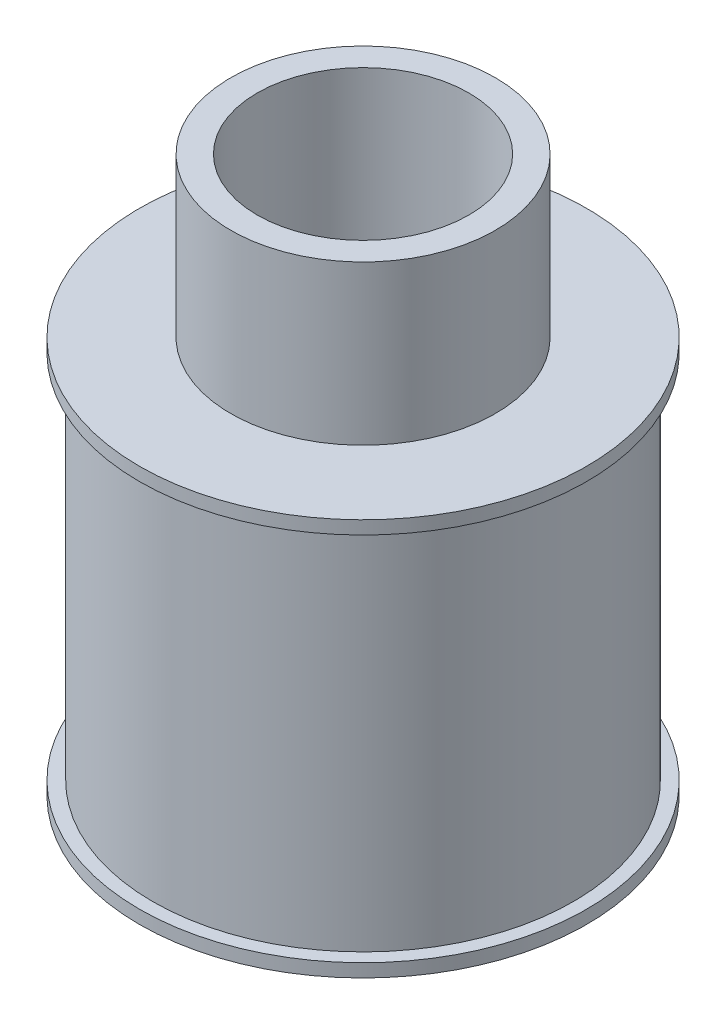
ISO-10303-21;
HEADER;
FILE_DESCRIPTION(('STEP AP214'),'2;1');
FILE_NAME('part.step','',(''),(''),'','','');
FILE_SCHEMA(('AUTOMOTIVE_DESIGN { 1 0 10303 214 1 1 1 1 }'));
ENDSEC;
DATA;
#1=APPLICATION_CONTEXT('core data for automotive mechanical design processes');
#2=APPLICATION_PROTOCOL_DEFINITION('international standard','automotive_design',2000,#1);
#3=PRODUCT_CONTEXT('',#1,'mechanical');
#4=PRODUCT('Part','Part','',(#3));
#5=PRODUCT_RELATED_PRODUCT_CATEGORY('part','',(#4));
#6=PRODUCT_DEFINITION_FORMATION('','',#4);
#7=PRODUCT_DEFINITION_CONTEXT('part definition',#1,'design');
#8=PRODUCT_DEFINITION('design','',#6,#7);
#9=PRODUCT_DEFINITION_SHAPE('','',#8);
#10=(LENGTH_UNIT() NAMED_UNIT(*) SI_UNIT(.MILLI.,.METRE.));
#11=(NAMED_UNIT(*) PLANE_ANGLE_UNIT() SI_UNIT($,.RADIAN.));
#12=(NAMED_UNIT(*) SI_UNIT($,.STERADIAN.) SOLID_ANGLE_UNIT());
#13=UNCERTAINTY_MEASURE_WITH_UNIT(LENGTH_MEASURE(1.E-05),#10,'distance_accuracy_value','');
#14=(GEOMETRIC_REPRESENTATION_CONTEXT(3) GLOBAL_UNCERTAINTY_ASSIGNED_CONTEXT((#13)) GLOBAL_UNIT_ASSIGNED_CONTEXT((#10,
#11,#12)) REPRESENTATION_CONTEXT('',''));
#15=CARTESIAN_POINT('',(0.,0.,0.));
#16=DIRECTION('',(0.,0.,1.));
#17=DIRECTION('',(1.,0.,0.));
#18=AXIS2_PLACEMENT_3D('',#15,#16,#17);
#19=CARTESIAN_POINT('',(0.,7.5,0.));
#20=DIRECTION('',(0.,-1.,0.));
#21=DIRECTION('',(0.,0.,-1.));
#22=AXIS2_PLACEMENT_3D('',#19,#20,#21);
#23=CYLINDRICAL_SURFACE('',#22,7.95);
#24=CARTESIAN_POINT('',(0.,-7.,0.));
#25=DIRECTION('',(0.,1.,0.));
#26=DIRECTION('',(0.,0.,1.));
#27=AXIS2_PLACEMENT_3D('',#24,#25,#26);
#28=CIRCLE('',#27,7.95);
#29=CARTESIAN_POINT('',(0.,-7.,7.95));
#30=VERTEX_POINT('',#29);
#31=EDGE_CURVE('E44',#30,#30,#28,.T.);
#32=ORIENTED_EDGE('',*,*,#31,.T.);
#33=EDGE_LOOP('',(#32));
#34=FACE_BOUND('',#33,.T.);
#35=CARTESIAN_POINT('',(0.,7.,0.));
#36=DIRECTION('',(0.,1.,0.));
#37=DIRECTION('',(0.,0.,1.));
#38=AXIS2_PLACEMENT_3D('',#35,#36,#37);
#39=CIRCLE('',#38,7.95);
#40=CARTESIAN_POINT('',(0.,7.,7.95));
#41=VERTEX_POINT('',#40);
#42=EDGE_CURVE('E10',#41,#41,#39,.T.);
#43=ORIENTED_EDGE('',*,*,#42,.F.);
#44=EDGE_LOOP('',(#43));
#45=FACE_BOUND('',#44,.T.);
#46=ADVANCED_FACE('F41',(#34,#45),#23,.T.);
#47=CARTESIAN_POINT('',(0.,7.,0.));
#48=DIRECTION('',(0.,1.,0.));
#49=DIRECTION('',(0.,0.,1.));
#50=AXIS2_PLACEMENT_3D('',#47,#48,#49);
#51=CYLINDRICAL_SURFACE('',#50,8.45);
#52=CARTESIAN_POINT('',(0.,7.,0.));
#53=DIRECTION('',(0.,1.,0.));
#54=DIRECTION('',(0.,0.,1.));
#55=AXIS2_PLACEMENT_3D('',#52,#53,#54);
#56=CIRCLE('',#55,8.45);
#57=CARTESIAN_POINT('',(0.,7.,8.45));
#58=VERTEX_POINT('',#57);
#59=EDGE_CURVE('E49',#58,#58,#56,.T.);
#60=ORIENTED_EDGE('',*,*,#59,.T.);
#61=EDGE_LOOP('',(#60));
#62=FACE_BOUND('',#61,.T.);
#63=CARTESIAN_POINT('',(0.,7.5,0.));
#64=DIRECTION('',(0.,1.,0.));
#65=DIRECTION('',(0.,0.,1.));
#66=AXIS2_PLACEMENT_3D('',#63,#64,#65);
#67=CIRCLE('',#66,8.45);
#68=CARTESIAN_POINT('',(0.,7.5,8.45));
#69=VERTEX_POINT('',#68);
#70=EDGE_CURVE('E55',#69,#69,#67,.T.);
#71=ORIENTED_EDGE('',*,*,#70,.F.);
#72=EDGE_LOOP('',(#71));
#73=FACE_BOUND('',#72,.T.);
#74=ADVANCED_FACE('F120',(#62,#73),#51,.T.);
#75=CARTESIAN_POINT('',(0.,7.,0.));
#76=DIRECTION('',(0.,1.,0.));
#77=DIRECTION('',(0.,0.,1.));
#78=AXIS2_PLACEMENT_3D('',#75,#76,#77);
#79=PLANE('',#78);
#80=ORIENTED_EDGE('',*,*,#42,.T.);
#81=EDGE_LOOP('',(#80));
#82=FACE_BOUND('',#81,.T.);
#83=ORIENTED_EDGE('',*,*,#59,.F.);
#84=EDGE_LOOP('',(#83));
#85=FACE_BOUND('',#84,.T.);
#86=ADVANCED_FACE('F115',(#82,#85),#79,.F.);
#87=CARTESIAN_POINT('',(0.,7.5,0.));
#88=DIRECTION('',(0.,1.,0.));
#89=DIRECTION('',(0.,0.,1.));
#90=AXIS2_PLACEMENT_3D('',#87,#88,#89);
#91=PLANE('',#90);
#92=CARTESIAN_POINT('',(0.,7.5,0.));
#93=DIRECTION('',(0.,1.,0.));
#94=DIRECTION('',(0.,0.,1.));
#95=AXIS2_PLACEMENT_3D('',#92,#93,#94);
#96=CIRCLE('',#95,5.);
#97=CARTESIAN_POINT('',(0.,7.5,-5.));
#98=VERTEX_POINT('',#97);
#99=EDGE_CURVE('E66',#98,#98,#96,.F.);
#100=ORIENTED_EDGE('',*,*,#99,.T.);
#101=EDGE_LOOP('',(#100));
#102=FACE_BOUND('',#101,.T.);
#103=ORIENTED_EDGE('',*,*,#70,.T.);
#104=EDGE_LOOP('',(#103));
#105=FACE_BOUND('',#104,.T.);
#106=ADVANCED_FACE('F105',(#102,#105),#91,.T.);
#107=CARTESIAN_POINT('',(0.,-7.,0.));
#108=DIRECTION('',(0.,-1.,0.));
#109=DIRECTION('',(0.,0.,-1.));
#110=AXIS2_PLACEMENT_3D('',#107,#108,#109);
#111=CYLINDRICAL_SURFACE('',#110,8.45);
#112=CARTESIAN_POINT('',(0.,-7.,0.));
#113=DIRECTION('',(0.,1.,0.));
#114=DIRECTION('',(0.,0.,1.));
#115=AXIS2_PLACEMENT_3D('',#112,#113,#114);
#116=CIRCLE('',#115,8.45);
#117=CARTESIAN_POINT('',(0.,-7.,8.45));
#118=VERTEX_POINT('',#117);
#119=EDGE_CURVE('E65',#118,#118,#116,.T.);
#120=ORIENTED_EDGE('',*,*,#119,.F.);
#121=EDGE_LOOP('',(#120));
#122=FACE_BOUND('',#121,.T.);
#123=CARTESIAN_POINT('',(0.,-7.5,0.));
#124=DIRECTION('',(0.,1.,0.));
#125=DIRECTION('',(0.,0.,1.));
#126=AXIS2_PLACEMENT_3D('',#123,#124,#125);
#127=CIRCLE('',#126,8.45);
#128=CARTESIAN_POINT('',(0.,-7.5,8.45));
#129=VERTEX_POINT('',#128);
#130=EDGE_CURVE('E61',#129,#129,#127,.T.);
#131=ORIENTED_EDGE('',*,*,#130,.T.);
#132=EDGE_LOOP('',(#131));
#133=FACE_BOUND('',#132,.T.);
#134=ADVANCED_FACE('F103',(#122,#133),#111,.T.);
#135=CARTESIAN_POINT('',(0.,-7.,0.));
#136=DIRECTION('',(0.,1.,0.));
#137=DIRECTION('',(0.,0.,1.));
#138=AXIS2_PLACEMENT_3D('',#135,#136,#137);
#139=PLANE('',#138);
#140=ORIENTED_EDGE('',*,*,#31,.F.);
#141=EDGE_LOOP('',(#140));
#142=FACE_BOUND('',#141,.T.);
#143=ORIENTED_EDGE('',*,*,#119,.T.);
#144=EDGE_LOOP('',(#143));
#145=FACE_BOUND('',#144,.T.);
#146=ADVANCED_FACE('F100',(#142,#145),#139,.T.);
#147=CARTESIAN_POINT('',(0.,-7.5,0.));
#148=DIRECTION('',(0.,1.,0.));
#149=DIRECTION('',(0.,0.,1.));
#150=AXIS2_PLACEMENT_3D('',#147,#148,#149);
#151=PLANE('',#150);
#152=CARTESIAN_POINT('',(0.,-7.5,0.));
#153=DIRECTION('',(0.,-1.,0.));
#154=DIRECTION('',(0.,0.,-1.));
#155=AXIS2_PLACEMENT_3D('',#152,#153,#154);
#156=CIRCLE('',#155,4.);
#157=CARTESIAN_POINT('',(0.,-7.5,-4.));
#158=VERTEX_POINT('',#157);
#159=EDGE_CURVE('E78',#158,#158,#156,.T.);
#160=ORIENTED_EDGE('',*,*,#159,.F.);
#161=EDGE_LOOP('',(#160));
#162=FACE_BOUND('',#161,.T.);
#163=ORIENTED_EDGE('',*,*,#130,.F.);
#164=EDGE_LOOP('',(#163));
#165=FACE_BOUND('',#164,.T.);
#166=ADVANCED_FACE('F96',(#162,#165),#151,.F.);
#167=CARTESIAN_POINT('',(0.,13.5,0.));
#168=DIRECTION('',(0.,-1.,0.));
#169=DIRECTION('',(0.,0.,-1.));
#170=AXIS2_PLACEMENT_3D('',#167,#168,#169);
#171=CYLINDRICAL_SURFACE('',#170,5.);
#172=CARTESIAN_POINT('',(0.,13.5,0.));
#173=DIRECTION('',(0.,1.,0.));
#174=DIRECTION('',(0.,0.,1.));
#175=AXIS2_PLACEMENT_3D('',#172,#173,#174);
#176=CIRCLE('',#175,5.);
#177=CARTESIAN_POINT('',(0.,13.5,-5.));
#178=VERTEX_POINT('',#177);
#179=EDGE_CURVE('E73',#178,#178,#176,.T.);
#180=CARTESIAN_POINT('',(0.,7.5,-5.));
#181=CARTESIAN_POINT('',(0.,7.5625,-5.));
#182=CARTESIAN_POINT('',(0.,7.625,-5.));
#183=CARTESIAN_POINT('',(0.,7.75,-5.));
#184=CARTESIAN_POINT('',(0.,7.8125,-5.));
#185=CARTESIAN_POINT('',(0.,7.9375,-5.));
#186=CARTESIAN_POINT('',(0.,8.,-5.));
#187=CARTESIAN_POINT('',(0.,8.125,-5.));
#188=CARTESIAN_POINT('',(0.,8.1875,-5.));
#189=CARTESIAN_POINT('',(0.,8.3125,-5.));
#190=CARTESIAN_POINT('',(0.,8.375,-5.));
#191=CARTESIAN_POINT('',(0.,8.5,-5.));
#192=CARTESIAN_POINT('',(0.,8.5625,-5.));
#193=CARTESIAN_POINT('',(0.,8.6875,-5.));
#194=CARTESIAN_POINT('',(0.,8.75,-5.));
#195=CARTESIAN_POINT('',(0.,8.875,-5.));
#196=CARTESIAN_POINT('',(0.,8.9375,-5.));
#197=CARTESIAN_POINT('',(0.,9.0625,-5.));
#198=CARTESIAN_POINT('',(0.,9.125,-5.));
#199=CARTESIAN_POINT('',(0.,9.25,-5.));
#200=CARTESIAN_POINT('',(0.,9.3125,-5.));
#201=CARTESIAN_POINT('',(0.,9.4375,-5.));
#202=CARTESIAN_POINT('',(0.,9.5,-5.));
#203=CARTESIAN_POINT('',(0.,9.625,-5.));
#204=CARTESIAN_POINT('',(0.,9.6875,-5.));
#205=CARTESIAN_POINT('',(0.,9.8125,-5.));
#206=CARTESIAN_POINT('',(0.,9.875,-5.));
#207=CARTESIAN_POINT('',(0.,10.,-5.));
#208=CARTESIAN_POINT('',(0.,10.0625,-5.));
#209=CARTESIAN_POINT('',(0.,10.1875,-5.));
#210=CARTESIAN_POINT('',(0.,10.25,-5.));
#211=CARTESIAN_POINT('',(0.,10.375,-5.));
#212=CARTESIAN_POINT('',(0.,10.4375,-5.));
#213=CARTESIAN_POINT('',(0.,10.5625,-5.));
#214=CARTESIAN_POINT('',(0.,10.625,-5.));
#215=CARTESIAN_POINT('',(0.,10.75,-5.));
#216=CARTESIAN_POINT('',(0.,10.8125,-5.));
#217=CARTESIAN_POINT('',(0.,10.9375,-5.));
#218=CARTESIAN_POINT('',(0.,11.,-5.));
#219=CARTESIAN_POINT('',(0.,11.125,-5.));
#220=CARTESIAN_POINT('',(0.,11.1875,-5.));
#221=CARTESIAN_POINT('',(0.,11.3125,-5.));
#222=CARTESIAN_POINT('',(0.,11.375,-5.));
#223=CARTESIAN_POINT('',(0.,11.5,-5.));
#224=CARTESIAN_POINT('',(0.,11.5625,-5.));
#225=CARTESIAN_POINT('',(0.,11.6875,-5.));
#226=CARTESIAN_POINT('',(0.,11.75,-5.));
#227=CARTESIAN_POINT('',(0.,11.875,-5.));
#228=CARTESIAN_POINT('',(0.,11.9375,-5.));
#229=CARTESIAN_POINT('',(0.,12.0625,-5.));
#230=CARTESIAN_POINT('',(0.,12.125,-5.));
#231=CARTESIAN_POINT('',(0.,12.25,-5.));
#232=CARTESIAN_POINT('',(0.,12.3125,-5.));
#233=CARTESIAN_POINT('',(0.,12.4375,-5.));
#234=CARTESIAN_POINT('',(0.,12.5,-5.));
#235=CARTESIAN_POINT('',(0.,12.625,-5.));
#236=CARTESIAN_POINT('',(0.,12.6875,-5.));
#237=CARTESIAN_POINT('',(0.,12.8125,-5.));
#238=CARTESIAN_POINT('',(0.,12.875,-5.));
#239=CARTESIAN_POINT('',(0.,13.,-5.));
#240=CARTESIAN_POINT('',(0.,13.0625,-5.));
#241=CARTESIAN_POINT('',(0.,13.1875,-5.));
#242=CARTESIAN_POINT('',(0.,13.25,-5.));
#243=CARTESIAN_POINT('',(0.,13.375,-5.));
#244=CARTESIAN_POINT('',(0.,13.4375,-5.));
#245=CARTESIAN_POINT('',(0.,13.5,-5.));
#246=B_SPLINE_CURVE_WITH_KNOTS('',3,(#180,#181,#182,#183,#184,#185,#186,#187,#188,#189,#190,
#191,#192,#193,#194,#195,#196,#197,#198,#199,#200,#201,#202,#203,#204,#205,#206,#207,#208,#209,
#210,#211,#212,#213,#214,#215,#216,#217,#218,#219,#220,#221,#222,#223,#224,#225,#226,#227,#228,
#229,#230,#231,#232,#233,#234,#235,#236,#237,#238,#239,#240,#241,#242,#243,#244,#245),
.UNSPECIFIED.,.F.,.F.,(4,2,2,2,2,2,2,2,2,2,2,2,2,2,2,2,2,2,2,2,2,2,2,2,2,2,2,2,2,2,2,2,4),(0.,
0.1875,0.375000000000001,0.562500000000001,0.750000000000002,0.937500000000002,1.125,1.3125,1.5,
1.6875,1.875,2.0625,2.25,2.4375,2.625,2.8125,3.,3.1875,3.375,3.5625,3.75,3.9375,4.125,4.3125,
4.5,4.6875,4.875,5.0625,5.25,5.4375,5.625,5.8125,6.),.UNSPECIFIED.);
#247=EDGE_CURVE('BSEAM99',#98,#178,#246,.T.);
#248=ORIENTED_EDGE('',*,*,#99,.F.);
#249=ORIENTED_EDGE('',*,*,#179,.F.);
#250=ORIENTED_EDGE('',*,*,#247,.T.);
#251=ORIENTED_EDGE('',*,*,#247,.F.);
#252=EDGE_LOOP('',(#248,#250,#249,#251));
#253=FACE_BOUND('',#252,.T.);
#254=ADVANCED_FACE('F99',(#253),#171,.T.);
#255=CARTESIAN_POINT('',(0.,13.5,0.));
#256=DIRECTION('',(0.,1.,0.));
#257=DIRECTION('',(0.,0.,1.));
#258=AXIS2_PLACEMENT_3D('',#255,#256,#257);
#259=PLANE('',#258);
#260=CARTESIAN_POINT('',(0.,13.5,0.));
#261=DIRECTION('',(0.,-1.,0.));
#262=DIRECTION('',(0.,0.,-1.));
#263=AXIS2_PLACEMENT_3D('',#260,#261,#262);
#264=CIRCLE('',#263,4.);
#265=CARTESIAN_POINT('',(0.,13.5,-4.));
#266=VERTEX_POINT('',#265);
#267=EDGE_CURVE('E77',#266,#266,#264,.T.);
#268=ORIENTED_EDGE('',*,*,#267,.T.);
#269=EDGE_LOOP('',(#268));
#270=FACE_BOUND('',#269,.T.);
#271=ORIENTED_EDGE('',*,*,#179,.T.);
#272=EDGE_LOOP('',(#271));
#273=FACE_BOUND('',#272,.T.);
#274=ADVANCED_FACE('F87',(#270,#273),#259,.T.);
#275=CARTESIAN_POINT('',(0.,13.5,0.));
#276=DIRECTION('',(0.,-1.,0.));
#277=DIRECTION('',(0.,0.,-1.));
#278=AXIS2_PLACEMENT_3D('',#275,#276,#277);
#279=CYLINDRICAL_SURFACE('',#278,4.);
#280=CARTESIAN_POINT('',(0.,13.5,-4.));
#281=CARTESIAN_POINT('',(0.,13.28125,-4.));
#282=CARTESIAN_POINT('',(0.,13.0625,-4.));
#283=CARTESIAN_POINT('',(0.,12.625,-4.));
#284=CARTESIAN_POINT('',(0.,12.40625,-4.));
#285=CARTESIAN_POINT('',(0.,11.96875,-4.));
#286=CARTESIAN_POINT('',(0.,11.75,-4.));
#287=CARTESIAN_POINT('',(0.,11.3125,-4.));
#288=CARTESIAN_POINT('',(0.,11.09375,-4.));
#289=CARTESIAN_POINT('',(0.,10.65625,-4.));
#290=CARTESIAN_POINT('',(0.,10.4375,-4.));
#291=CARTESIAN_POINT('',(0.,10.,-4.));
#292=CARTESIAN_POINT('',(0.,9.78125,-4.));
#293=CARTESIAN_POINT('',(0.,9.34375,-4.));
#294=CARTESIAN_POINT('',(0.,9.125,-4.));
#295=CARTESIAN_POINT('',(0.,8.6875,-4.));
#296=CARTESIAN_POINT('',(0.,8.46875,-4.));
#297=CARTESIAN_POINT('',(0.,8.03125,-4.));
#298=CARTESIAN_POINT('',(0.,7.8125,-4.));
#299=CARTESIAN_POINT('',(0.,7.375,-4.));
#300=CARTESIAN_POINT('',(0.,7.15625,-4.));
#301=CARTESIAN_POINT('',(0.,6.71875,-4.));
#302=CARTESIAN_POINT('',(0.,6.5,-4.));
#303=CARTESIAN_POINT('',(0.,6.0625,-4.));
#304=CARTESIAN_POINT('',(0.,5.84375,-4.));
#305=CARTESIAN_POINT('',(0.,5.40625,-4.));
#306=CARTESIAN_POINT('',(0.,5.1875,-4.));
#307=CARTESIAN_POINT('',(0.,4.75,-4.));
#308=CARTESIAN_POINT('',(0.,4.53125,-4.));
#309=CARTESIAN_POINT('',(0.,4.09375,-4.));
#310=CARTESIAN_POINT('',(0.,3.875,-4.));
#311=CARTESIAN_POINT('',(0.,3.4375,-4.));
#312=CARTESIAN_POINT('',(0.,3.21875,-4.));
#313=CARTESIAN_POINT('',(0.,2.78125,-4.));
#314=CARTESIAN_POINT('',(0.,2.5625,-4.));
#315=CARTESIAN_POINT('',(0.,2.125,-4.));
#316=CARTESIAN_POINT('',(0.,1.90625,-4.));
#317=CARTESIAN_POINT('',(0.,1.46875,-4.));
#318=CARTESIAN_POINT('',(0.,1.25,-4.));
#319=CARTESIAN_POINT('',(0.,0.812500000000001,-4.));
#320=CARTESIAN_POINT('',(0.,0.593750000000001,-4.));
#321=CARTESIAN_POINT('',(0.,0.15625,-4.));
#322=CARTESIAN_POINT('',(0.,-0.0625000000000001,-4.));
#323=CARTESIAN_POINT('',(0.,-0.5,-4.));
#324=CARTESIAN_POINT('',(0.,-0.718749999999999,-4.));
#325=CARTESIAN_POINT('',(0.,-1.15625,-4.));
#326=CARTESIAN_POINT('',(0.,-1.375,-4.));
#327=CARTESIAN_POINT('',(0.,-1.8125,-4.));
#328=CARTESIAN_POINT('',(0.,-2.03125,-4.));
#329=CARTESIAN_POINT('',(0.,-2.46875,-4.));
#330=CARTESIAN_POINT('',(0.,-2.6875,-4.));
#331=CARTESIAN_POINT('',(0.,-3.125,-4.));
#332=CARTESIAN_POINT('',(0.,-3.34375,-4.));
#333=CARTESIAN_POINT('',(0.,-3.78125,-4.));
#334=CARTESIAN_POINT('',(0.,-4.,-4.));
#335=CARTESIAN_POINT('',(0.,-4.4375,-4.));
#336=CARTESIAN_POINT('',(0.,-4.65625,-4.));
#337=CARTESIAN_POINT('',(0.,-5.09375,-4.));
#338=CARTESIAN_POINT('',(0.,-5.3125,-4.));
#339=CARTESIAN_POINT('',(0.,-5.75,-4.));
#340=CARTESIAN_POINT('',(0.,-5.96875,-4.));
#341=CARTESIAN_POINT('',(0.,-6.40625,-4.));
#342=CARTESIAN_POINT('',(0.,-6.625,-4.));
#343=CARTESIAN_POINT('',(0.,-7.0625,-4.));
#344=CARTESIAN_POINT('',(0.,-7.28125,-4.));
#345=CARTESIAN_POINT('',(0.,-7.5,-4.));
#346=B_SPLINE_CURVE_WITH_KNOTS('',3,(#280,#281,#282,#283,#284,#285,#286,#287,#288,#289,#290,
#291,#292,#293,#294,#295,#296,#297,#298,#299,#300,#301,#302,#303,#304,#305,#306,#307,#308,#309,
#310,#311,#312,#313,#314,#315,#316,#317,#318,#319,#320,#321,#322,#323,#324,#325,#326,#327,#328,
#329,#330,#331,#332,#333,#334,#335,#336,#337,#338,#339,#340,#341,#342,#343,#344,#345),
.UNSPECIFIED.,.F.,.F.,(4,2,2,2,2,2,2,2,2,2,2,2,2,2,2,2,2,2,2,2,2,2,2,2,2,2,2,2,2,2,2,2,4),(0.,
0.656249999999999,1.3125,1.96875,2.625,3.28125,3.9375,4.59375,5.25,5.90625,6.5625,7.21875,7.875,
8.53125,9.1875,9.84375,10.5,11.15625,11.8125,12.46875,13.125,13.78125,14.4375,15.09375,15.75,
16.40625,17.0625,17.71875,18.375,19.03125,19.6875,20.34375,21.),.UNSPECIFIED.);
#347=EDGE_CURVE('BSEAM90',#266,#158,#346,.T.);
#348=ORIENTED_EDGE('',*,*,#267,.F.);
#349=ORIENTED_EDGE('',*,*,#159,.T.);
#350=ORIENTED_EDGE('',*,*,#347,.T.);
#351=ORIENTED_EDGE('',*,*,#347,.F.);
#352=EDGE_LOOP('',(#348,#350,#349,#351));
#353=FACE_BOUND('',#352,.T.);
#354=ADVANCED_FACE('F90',(#353),#279,.F.);
#355=CLOSED_SHELL('',(#46,#74,#86,#106,#134,#146,#166,#254,#274,#354));
#356=MANIFOLD_SOLID_BREP('B2',#355);
#357=ADVANCED_BREP_SHAPE_REPRESENTATION('',(#18,#356),#14);
#358=SHAPE_DEFINITION_REPRESENTATION(#9,#357);
ENDSEC;
END-ISO-10303-21;
